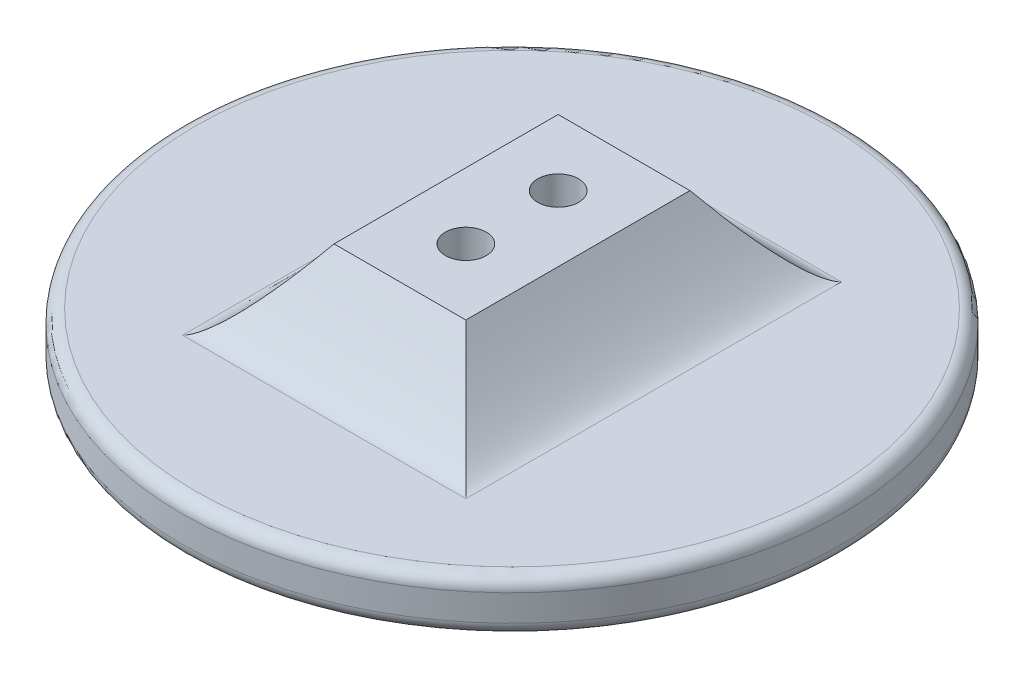
ISO-10303-21;
HEADER;
FILE_DESCRIPTION(('STEP AP214'),'2;1');
FILE_NAME('part.step','',(''),(''),'','','');
FILE_SCHEMA(('AUTOMOTIVE_DESIGN { 1 0 10303 214 1 1 1 1 }'));
ENDSEC;
DATA;
#1=APPLICATION_CONTEXT('core data for automotive mechanical design processes');
#2=APPLICATION_PROTOCOL_DEFINITION('international standard','automotive_design',2000,#1);
#3=PRODUCT_CONTEXT('',#1,'mechanical');
#4=PRODUCT('Part','Part','',(#3));
#5=PRODUCT_RELATED_PRODUCT_CATEGORY('part','',(#4));
#6=PRODUCT_DEFINITION_FORMATION('','',#4);
#7=PRODUCT_DEFINITION_CONTEXT('part definition',#1,'design');
#8=PRODUCT_DEFINITION('design','',#6,#7);
#9=PRODUCT_DEFINITION_SHAPE('','',#8);
#10=(LENGTH_UNIT() NAMED_UNIT(*) SI_UNIT(.MILLI.,.METRE.));
#11=(NAMED_UNIT(*) PLANE_ANGLE_UNIT() SI_UNIT($,.RADIAN.));
#12=(NAMED_UNIT(*) SI_UNIT($,.STERADIAN.) SOLID_ANGLE_UNIT());
#13=UNCERTAINTY_MEASURE_WITH_UNIT(LENGTH_MEASURE(1.E-05),#10,'distance_accuracy_value','');
#14=(GEOMETRIC_REPRESENTATION_CONTEXT(3) GLOBAL_UNCERTAINTY_ASSIGNED_CONTEXT((#13)) GLOBAL_UNIT_ASSIGNED_CONTEXT((#10,
#11,#12)) REPRESENTATION_CONTEXT('',''));
#15=CARTESIAN_POINT('',(0.,0.,0.));
#16=DIRECTION('',(0.,0.,1.));
#17=DIRECTION('',(1.,0.,0.));
#18=AXIS2_PLACEMENT_3D('',#15,#16,#17);
#19=CARTESIAN_POINT('',(0.,0.,0.));
#20=DIRECTION('',(0.,1.,0.));
#21=DIRECTION('',(0.,0.,1.));
#22=AXIS2_PLACEMENT_3D('',#19,#20,#21);
#23=PLANE('',#22);
#24=CARTESIAN_POINT('',(0.,0.,0.));
#25=DIRECTION('',(0.,1.,0.));
#26=DIRECTION('',(0.,0.,1.));
#27=AXIS2_PLACEMENT_3D('',#24,#25,#26);
#28=CIRCLE('',#27,24.);
#29=CARTESIAN_POINT('',(0.,0.,24.));
#30=VERTEX_POINT('',#29);
#31=EDGE_CURVE('E12',#30,#30,#28,.F.);
#32=ORIENTED_EDGE('',*,*,#31,.T.);
#33=EDGE_LOOP('',(#32));
#34=FACE_BOUND('',#33,.T.);
#35=CARTESIAN_POINT('',(0.,0.,3.5));
#36=DIRECTION('',(0.,-1.,0.));
#37=DIRECTION('',(0.,0.,-1.));
#38=AXIS2_PLACEMENT_3D('',#35,#36,#37);
#39=CIRCLE('',#38,2.9);
#40=CARTESIAN_POINT('',(0.,0.,0.6));
#41=VERTEX_POINT('',#40);
#42=EDGE_CURVE('E352',#41,#41,#39,.T.);
#43=ORIENTED_EDGE('',*,*,#42,.F.);
#44=EDGE_LOOP('',(#43));
#45=FACE_BOUND('',#44,.T.);
#46=CARTESIAN_POINT('',(0.,0.,-3.5));
#47=DIRECTION('',(0.,1.,0.));
#48=DIRECTION('',(0.,0.,1.));
#49=AXIS2_PLACEMENT_3D('',#46,#47,#48);
#50=CIRCLE('',#49,2.9);
#51=CARTESIAN_POINT('',(0.,0.,-0.6));
#52=VERTEX_POINT('',#51);
#53=EDGE_CURVE('E348',#52,#52,#50,.T.);
#54=ORIENTED_EDGE('',*,*,#53,.T.);
#55=EDGE_LOOP('',(#54));
#56=FACE_BOUND('',#55,.T.);
#57=ADVANCED_FACE('F45',(#34,#45,#56),#23,.F.);
#58=CARTESIAN_POINT('',(0.,0.,3.5));
#59=DIRECTION('',(0.,1.,0.));
#60=DIRECTION('',(0.,0.,1.));
#61=AXIS2_PLACEMENT_3D('',#58,#59,#60);
#62=CYLINDRICAL_SURFACE('',#61,1.55);
#63=CARTESIAN_POINT('',(0.,10.,3.5));
#64=DIRECTION('',(0.,-1.,0.));
#65=DIRECTION('',(0.,0.,-1.));
#66=AXIS2_PLACEMENT_3D('',#63,#64,#65);
#67=CIRCLE('',#66,1.55);
#68=CARTESIAN_POINT('',(0.,10.,1.95));
#69=VERTEX_POINT('',#68);
#70=EDGE_CURVE('E253',#69,#69,#67,.T.);
#71=ORIENTED_EDGE('',*,*,#70,.F.);
#72=EDGE_LOOP('',(#71));
#73=FACE_BOUND('',#72,.T.);
#74=CARTESIAN_POINT('',(0.,6.1,3.5));
#75=DIRECTION('',(0.,-1.,0.));
#76=DIRECTION('',(0.,0.,-1.));
#77=AXIS2_PLACEMENT_3D('',#74,#75,#76);
#78=CIRCLE('',#77,1.55);
#79=CARTESIAN_POINT('',(0.,6.1,1.95));
#80=VERTEX_POINT('',#79);
#81=EDGE_CURVE('E248',#80,#80,#78,.T.);
#82=ORIENTED_EDGE('',*,*,#81,.T.);
#83=EDGE_LOOP('',(#82));
#84=FACE_BOUND('',#83,.T.);
#85=ADVANCED_FACE('F216',(#73,#84),#62,.F.);
#86=CARTESIAN_POINT('',(0.,10.,0.));
#87=DIRECTION('',(0.,-1.,0.));
#88=DIRECTION('',(0.,0.,-1.));
#89=AXIS2_PLACEMENT_3D('',#86,#87,#88);
#90=PLANE('',#89);
#91=CARTESIAN_POINT('',(5.,10.,-15.6690189111918));
#92=CARTESIAN_POINT('',(5.,10.,-15.1942001563072));
#93=CARTESIAN_POINT('',(5.,10.,-14.7193814014226));
#94=CARTESIAN_POINT('',(5.,10.,-4.74818754884601));
#95=CARTESIAN_POINT('',(5.,10.,4.74818754885425));
#96=CARTESIAN_POINT('',(5.,10.,14.7193814014222));
#97=CARTESIAN_POINT('',(5.,10.,15.1942001563075));
#98=CARTESIAN_POINT('',(5.,10.,15.6690189111918));
#99=(BOUNDED_CURVE() B_SPLINE_CURVE(3,(#91,#92,#93,#94,#95,#96,#97,#98),.UNSPECIFIED.,.F.,
.F.) B_SPLINE_CURVE_WITH_KNOTS((4,2,2,4),(-0.00716901891119183,-0.00574456264653803,
0.022744562646538,0.0241690189111918),
.UNSPECIFIED.) CURVE() GEOMETRIC_REPRESENTATION_ITEM() RATIONAL_B_SPLINE_CURVE((1.,1.,1.,1.,1.,
1.,1.,1.)) REPRESENTATION_ITEM(''));
#100=CARTESIAN_POINT('',(5.,10.,8.5));
#101=VERTEX_POINT('',#100);
#102=CARTESIAN_POINT('',(5.,10.,-8.5));
#103=VERTEX_POINT('',#102);
#104=EDGE_CURVE('E90',#101,#103,#99,.F.);
#105=ORIENTED_EDGE('',*,*,#104,.T.);
#106=CARTESIAN_POINT('',(-11.8817907788649,10.,-8.5));
#107=CARTESIAN_POINT('',(-11.5027147347557,10.,-8.5));
#108=CARTESIAN_POINT('',(-11.1236386906473,10.,-8.5));
#109=CARTESIAN_POINT('',(-3.16304176435211,10.,-8.5));
#110=CARTESIAN_POINT('',(4.41847911782066,10.,-8.5));
#111=CARTESIAN_POINT('',(12.379076044109,10.,-8.5));
#112=CARTESIAN_POINT('',(12.7581520882179,10.,-8.5));
#113=CARTESIAN_POINT('',(13.1372281323269,10.,-8.5));
#114=(BOUNDED_CURVE() B_SPLINE_CURVE(3,(#106,#107,#108,#109,#110,#111,#112,#113),.UNSPECIFIED.,
.F.,.F.) B_SPLINE_CURVE_WITH_KNOTS((4,2,2,4),(-0.0181372281323269,-0.017,0.00574456264653803,
0.00688179077886493),
.UNSPECIFIED.) CURVE() GEOMETRIC_REPRESENTATION_ITEM() RATIONAL_B_SPLINE_CURVE((1.,1.,1.,1.,1.,
1.,1.,1.)) REPRESENTATION_ITEM(''));
#115=CARTESIAN_POINT('',(-5.,10.,-8.5));
#116=VERTEX_POINT('',#115);
#117=EDGE_CURVE('E97',#103,#116,#114,.F.);
#118=ORIENTED_EDGE('',*,*,#117,.T.);
#119=CARTESIAN_POINT('',(-5.,10.,17.05));
#120=CARTESIAN_POINT('',(-5.,10.,16.533333333333));
#121=CARTESIAN_POINT('',(-5.,10.,16.0166666666671));
#122=CARTESIAN_POINT('',(-5.,10.,5.1666666666577));
#123=CARTESIAN_POINT('',(-5.,10.,-5.16666666666667));
#124=CARTESIAN_POINT('',(-5.,10.,-16.0166666666667));
#125=CARTESIAN_POINT('',(-5.,10.,-16.5333333333333));
#126=CARTESIAN_POINT('',(-5.,10.,-17.05));
#127=(BOUNDED_CURVE() B_SPLINE_CURVE(3,(#119,#120,#121,#122,#123,#124,#125,#126),.UNSPECIFIED.,
.F.,.F.) B_SPLINE_CURVE_WITH_KNOTS((4,2,2,4),(-0.02555,-0.024,0.007,0.00855),
.UNSPECIFIED.) CURVE() GEOMETRIC_REPRESENTATION_ITEM() RATIONAL_B_SPLINE_CURVE((1.,1.,1.,1.,1.,
1.,1.,1.)) REPRESENTATION_ITEM(''));
#128=CARTESIAN_POINT('',(-5.,10.,8.5));
#129=VERTEX_POINT('',#128);
#130=EDGE_CURVE('E126',#116,#129,#127,.F.);
#131=ORIENTED_EDGE('',*,*,#130,.T.);
#132=CARTESIAN_POINT('',(13.1372281323269,10.,8.5));
#133=CARTESIAN_POINT('',(12.7581520882179,10.,8.5));
#134=CARTESIAN_POINT('',(12.379076044109,10.,8.5));
#135=CARTESIAN_POINT('',(4.41847911782066,10.,8.5));
#136=CARTESIAN_POINT('',(-3.16304176435211,10.,8.5));
#137=CARTESIAN_POINT('',(-11.1236386906473,10.,8.5));
#138=CARTESIAN_POINT('',(-11.5027147347557,10.,8.5));
#139=CARTESIAN_POINT('',(-11.8817907788649,10.,8.5));
#140=(BOUNDED_CURVE() B_SPLINE_CURVE(3,(#132,#133,#134,#135,#136,#137,#138,#139),.UNSPECIFIED.,
.F.,.F.) B_SPLINE_CURVE_WITH_KNOTS((4,2,2,4),(-0.00688179077886493,-0.00574456264653803,0.017,
0.0181372281323269),
.UNSPECIFIED.) CURVE() GEOMETRIC_REPRESENTATION_ITEM() RATIONAL_B_SPLINE_CURVE((1.,1.,1.,1.,1.,
1.,1.,1.)) REPRESENTATION_ITEM(''));
#141=EDGE_CURVE('E100',#129,#101,#140,.F.);
#142=ORIENTED_EDGE('',*,*,#141,.T.);
#143=EDGE_LOOP('',(#105,#118,#131,#142));
#144=FACE_BOUND('',#143,.T.);
#145=ORIENTED_EDGE('',*,*,#70,.T.);
#146=EDGE_LOOP('',(#145));
#147=FACE_BOUND('',#146,.T.);
#148=CARTESIAN_POINT('',(0.,10.,-3.5));
#149=DIRECTION('',(0.,1.,0.));
#150=DIRECTION('',(0.,0.,1.));
#151=AXIS2_PLACEMENT_3D('',#148,#149,#150);
#152=CIRCLE('',#151,1.55);
#153=CARTESIAN_POINT('',(0.,10.,-1.95));
#154=VERTEX_POINT('',#153);
#155=EDGE_CURVE('E339',#154,#154,#152,.T.);
#156=ORIENTED_EDGE('',*,*,#155,.F.);
#157=EDGE_LOOP('',(#156));
#158=FACE_BOUND('',#157,.T.);
#159=ADVANCED_FACE('F93',(#144,#147,#158),#90,.F.);
#160=CARTESIAN_POINT('',(0.,4.,0.));
#161=DIRECTION('',(0.,-1.,0.));
#162=DIRECTION('',(0.,0.,-1.));
#163=AXIS2_PLACEMENT_3D('',#160,#161,#162);
#164=CYLINDRICAL_SURFACE('',#163,25.);
#165=CARTESIAN_POINT('',(0.,3.,0.));
#166=DIRECTION('',(0.,1.,0.));
#167=DIRECTION('',(0.,0.,1.));
#168=AXIS2_PLACEMENT_3D('',#165,#166,#167);
#169=CIRCLE('',#168,25.);
#170=CARTESIAN_POINT('',(0.,3.,25.));
#171=VERTEX_POINT('',#170);
#172=EDGE_CURVE('E54',#171,#171,#169,.F.);
#173=ORIENTED_EDGE('',*,*,#172,.T.);
#174=EDGE_LOOP('',(#173));
#175=FACE_BOUND('',#174,.T.);
#176=CARTESIAN_POINT('',(0.,1.,0.));
#177=DIRECTION('',(0.,1.,0.));
#178=DIRECTION('',(0.,0.,1.));
#179=AXIS2_PLACEMENT_3D('',#176,#177,#178);
#180=CIRCLE('',#179,25.);
#181=CARTESIAN_POINT('',(0.,1.,25.));
#182=VERTEX_POINT('',#181);
#183=EDGE_CURVE('E258',#182,#182,#180,.T.);
#184=ORIENTED_EDGE('',*,*,#183,.T.);
#185=EDGE_LOOP('',(#184));
#186=FACE_BOUND('',#185,.T.);
#187=ADVANCED_FACE('F215',(#175,#186),#164,.T.);
#188=CARTESIAN_POINT('',(0.,4.,0.));
#189=DIRECTION('',(0.,1.,0.));
#190=DIRECTION('',(0.,0.,1.));
#191=AXIS2_PLACEMENT_3D('',#188,#189,#190);
#192=PLANE('',#191);
#193=CARTESIAN_POINT('',(0.,4.,0.));
#194=DIRECTION('',(0.,1.,0.));
#195=DIRECTION('',(0.,0.,1.));
#196=AXIS2_PLACEMENT_3D('',#193,#194,#195);
#197=CIRCLE('',#196,24.);
#198=CARTESIAN_POINT('',(0.,4.,24.));
#199=VERTEX_POINT('',#198);
#200=EDGE_CURVE('E254',#199,#199,#197,.T.);
#201=ORIENTED_EDGE('',*,*,#200,.T.);
#202=EDGE_LOOP('',(#201));
#203=FACE_BOUND('',#202,.T.);
#204=CARTESIAN_POINT('',(-11.8817907788649,4.,14.244562646538));
#205=CARTESIAN_POINT('',(-11.5027147347557,4.,14.244562646538));
#206=CARTESIAN_POINT('',(-11.1236386906473,4.,14.244562646538));
#207=CARTESIAN_POINT('',(-3.16304176435211,4.,14.244562646538));
#208=CARTESIAN_POINT('',(4.41847911782066,4.,14.244562646538));
#209=CARTESIAN_POINT('',(12.379076044109,4.,14.244562646538));
#210=CARTESIAN_POINT('',(12.7581520882179,4.,14.244562646538));
#211=CARTESIAN_POINT('',(13.1372281323269,4.,14.244562646538));
#212=(BOUNDED_CURVE() B_SPLINE_CURVE(3,(#204,#205,#206,#207,#208,#209,#210,#211),.UNSPECIFIED.,
.F.,.F.) B_SPLINE_CURVE_WITH_KNOTS((4,2,2,4),(-0.00688179077886493,-0.00574456264653803,0.017,
0.0181372281323269),
.UNSPECIFIED.) CURVE() GEOMETRIC_REPRESENTATION_ITEM() RATIONAL_B_SPLINE_CURVE((1.,1.,1.,1.,1.,
1.,1.,1.)) REPRESENTATION_ITEM(''));
#213=CARTESIAN_POINT('',(10.744562646538,4.,14.2445626465165));
#214=VERTEX_POINT('',#213);
#215=CARTESIAN_POINT('',(-10.7445626465551,4.,14.244562646538));
#216=VERTEX_POINT('',#215);
#217=EDGE_CURVE('E70',#214,#216,#212,.F.);
#218=ORIENTED_EDGE('',*,*,#217,.T.);
#219=CARTESIAN_POINT('',(-10.744562646538,4.,-17.05));
#220=CARTESIAN_POINT('',(-10.744562646538,4.,-16.5333333333333));
#221=CARTESIAN_POINT('',(-10.744562646538,4.,-16.0166666666667));
#222=CARTESIAN_POINT('',(-10.744562646538,4.,-5.16666666666667));
#223=CARTESIAN_POINT('',(-10.744562646538,4.,5.1666666666577));
#224=CARTESIAN_POINT('',(-10.744562646538,4.,16.0166666666671));
#225=CARTESIAN_POINT('',(-10.744562646538,4.,16.533333333333));
#226=CARTESIAN_POINT('',(-10.744562646538,4.,17.05));
#227=(BOUNDED_CURVE() B_SPLINE_CURVE(3,(#219,#220,#221,#222,#223,#224,#225,#226),.UNSPECIFIED.,
.F.,.F.) B_SPLINE_CURVE_WITH_KNOTS((4,2,2,4),(-0.02555,-0.024,0.007,0.00855),
.UNSPECIFIED.) CURVE() GEOMETRIC_REPRESENTATION_ITEM() RATIONAL_B_SPLINE_CURVE((1.,1.,1.,1.,1.,
1.,1.,1.)) REPRESENTATION_ITEM(''));
#228=CARTESIAN_POINT('',(-10.744562646555,4.,-14.244562646538));
#229=VERTEX_POINT('',#228);
#230=EDGE_CURVE('E259',#216,#229,#227,.F.);
#231=ORIENTED_EDGE('',*,*,#230,.T.);
#232=CARTESIAN_POINT('',(13.1372281323269,4.,-14.244562646538));
#233=CARTESIAN_POINT('',(12.7581520882179,4.,-14.244562646538));
#234=CARTESIAN_POINT('',(12.379076044109,4.,-14.244562646538));
#235=CARTESIAN_POINT('',(4.41847911782066,4.,-14.244562646538));
#236=CARTESIAN_POINT('',(-3.16304176435211,4.,-14.244562646538));
#237=CARTESIAN_POINT('',(-11.1236386906473,4.,-14.244562646538));
#238=CARTESIAN_POINT('',(-11.5027147347557,4.,-14.244562646538));
#239=CARTESIAN_POINT('',(-11.8817907788649,4.,-14.244562646538));
#240=(BOUNDED_CURVE() B_SPLINE_CURVE(3,(#232,#233,#234,#235,#236,#237,#238,#239),.UNSPECIFIED.,
.F.,.F.) B_SPLINE_CURVE_WITH_KNOTS((4,2,2,4),(-0.0181372281323269,-0.017,0.00574456264653803,
0.00688179077886493),
.UNSPECIFIED.) CURVE() GEOMETRIC_REPRESENTATION_ITEM() RATIONAL_B_SPLINE_CURVE((1.,1.,1.,1.,1.,
1.,1.,1.)) REPRESENTATION_ITEM(''));
#241=CARTESIAN_POINT('',(10.744562646538,4.,-14.2445626465373));
#242=VERTEX_POINT('',#241);
#243=EDGE_CURVE('E381',#229,#242,#240,.F.);
#244=ORIENTED_EDGE('',*,*,#243,.T.);
#245=CARTESIAN_POINT('',(10.744562646538,4.,15.6690189111918));
#246=CARTESIAN_POINT('',(10.744562646538,4.,15.1942001563075));
#247=CARTESIAN_POINT('',(10.744562646538,4.,14.7193814014222));
#248=CARTESIAN_POINT('',(10.744562646538,4.,4.74818754885425));
#249=CARTESIAN_POINT('',(10.744562646538,4.,-4.74818754884601));
#250=CARTESIAN_POINT('',(10.744562646538,4.,-14.7193814014226));
#251=CARTESIAN_POINT('',(10.744562646538,4.,-15.1942001563072));
#252=CARTESIAN_POINT('',(10.744562646538,4.,-15.6690189111918));
#253=(BOUNDED_CURVE() B_SPLINE_CURVE(3,(#245,#246,#247,#248,#249,#250,#251,#252),.UNSPECIFIED.,
.F.,.F.) B_SPLINE_CURVE_WITH_KNOTS((4,2,2,4),(-0.00716901891119183,-0.00574456264653803,
0.022744562646538,0.0241690189111918),
.UNSPECIFIED.) CURVE() GEOMETRIC_REPRESENTATION_ITEM() RATIONAL_B_SPLINE_CURVE((1.,1.,1.,1.,1.,
1.,1.,1.)) REPRESENTATION_ITEM(''));
#254=EDGE_CURVE('E114',#242,#214,#253,.F.);
#255=ORIENTED_EDGE('',*,*,#254,.T.);
#256=EDGE_LOOP('',(#218,#231,#244,#255));
#257=FACE_BOUND('',#256,.T.);
#258=ADVANCED_FACE('F218',(#203,#257),#192,.T.);
#259=CARTESIAN_POINT('',(5.,10.,15.6690189111918));
#260=CARTESIAN_POINT('',(5.,10.,15.1942001563075));
#261=CARTESIAN_POINT('',(5.,10.,14.7193814014222));
#262=CARTESIAN_POINT('',(5.,10.,4.74818754885425));
#263=CARTESIAN_POINT('',(5.,10.,-4.74818754884601));
#264=CARTESIAN_POINT('',(5.,10.,-14.7193814014226));
#265=CARTESIAN_POINT('',(5.,10.,-15.1942001563072));
#266=CARTESIAN_POINT('',(5.,10.,-15.6690189111918));
#267=CARTESIAN_POINT('',(9.17786374293675,4.,15.6690189111918));
#268=CARTESIAN_POINT('',(9.17786374293675,4.,15.1942001563075));
#269=CARTESIAN_POINT('',(9.17786374293675,4.,14.7193814014222));
#270=CARTESIAN_POINT('',(9.17786374293675,4.,4.74818754885425));
#271=CARTESIAN_POINT('',(9.17786374293675,4.,-4.74818754884601));
#272=CARTESIAN_POINT('',(9.17786374293675,4.,-14.7193814014226));
#273=CARTESIAN_POINT('',(9.17786374293675,4.,-15.1942001563072));
#274=CARTESIAN_POINT('',(9.17786374293675,4.,-15.6690189111918));
#275=CARTESIAN_POINT('',(10.744562646538,4.,15.6690189111918));
#276=CARTESIAN_POINT('',(10.744562646538,4.,15.1942001563075));
#277=CARTESIAN_POINT('',(10.744562646538,4.,14.7193814014222));
#278=CARTESIAN_POINT('',(10.744562646538,4.,4.74818754885425));
#279=CARTESIAN_POINT('',(10.744562646538,4.,-4.74818754884601));
#280=CARTESIAN_POINT('',(10.744562646538,4.,-14.7193814014226));
#281=CARTESIAN_POINT('',(10.744562646538,4.,-15.1942001563072));
#282=CARTESIAN_POINT('',(10.744562646538,4.,-15.6690189111918));
#283=(BOUNDED_SURFACE() B_SPLINE_SURFACE(2,3,((#259,#260,#261,#262,#263,#264,#265,#266),(#267,
#268,#269,#270,#271,#272,#273,#274),(#275,#276,#277,#278,#279,#280,#281,#282)),.UNSPECIFIED.,
.F.,.F.,.F.) B_SPLINE_SURFACE_WITH_KNOTS((3,3),(4,2,2,4),(0.,1.),(-0.00716901891119183,
-0.00574456264653803,0.022744562646538,0.0241690189111918),
.UNSPECIFIED.) GEOMETRIC_REPRESENTATION_ITEM() RATIONAL_B_SPLINE_SURFACE(((1.,1.,1.,1.,1.,1.,1.,
1.),(0.886405260427918,0.886405260427918,0.886405260427918,0.886405260427918,0.886405260427918,
0.886405260427918,0.886405260427918,0.886405260427918),(1.,1.,1.,1.,1.,1.,1.,1.))) REPRESENTATION_ITEM('') SURFACE());
#284=CARTESIAN_POINT('',(10.7445626465393,4.,14.244562646538));
#285=CARTESIAN_POINT('',(10.7332712110502,4.00000088450244,14.2332713393006));
#286=CARTESIAN_POINT('',(10.7219774747557,4.00029748881483,14.221984906246));
#287=CARTESIAN_POINT('',(10.6990102338456,4.00145539801306,14.1990438716068));
#288=CARTESIAN_POINT('',(10.6873370072327,4.00233574669762,14.1873899377852));
#289=CARTESIAN_POINT('',(10.6636109924538,4.00466797712799,14.1637117223783));
#290=CARTESIAN_POINT('',(10.6515589901475,4.00613851293399,14.1516885213183));
#291=CARTESIAN_POINT('',(10.6270750579775,4.00965946342711,14.1272693653449));
#292=CARTESIAN_POINT('',(10.6146443531626,4.01172812054216,14.1148748485504));
#293=CARTESIAN_POINT('',(10.5761304208036,4.01893586316296,14.0764790773808));
#294=CARTESIAN_POINT('',(10.5501241963843,4.02494353613716,14.0505612697444));
#295=CARTESIAN_POINT('',(10.4965826684866,4.03929978084282,13.9972023577703));
#296=CARTESIAN_POINT('',(10.4690656458864,4.04778125128026,13.9697795124293));
#297=CARTESIAN_POINT('',(10.4124953525799,4.06714911682546,13.9133917875377));
#298=CARTESIAN_POINT('',(10.3834638942228,4.07815927843524,13.8844478995361));
#299=CARTESIAN_POINT('',(10.3238622175821,4.10264450268669,13.8250060932629));
#300=CARTESIAN_POINT('',(10.2933164473649,4.11623408698512,13.7945312390893));
#301=CARTESIAN_POINT('',(10.2306836758385,4.14593511313779,13.7320179092761));
#302=CARTESIAN_POINT('',(10.1986227477131,4.16215215696602,13.7000037887345));
#303=CARTESIAN_POINT('',(10.1329584448309,4.19716114943245,13.6344060494039));
#304=CARTESIAN_POINT('',(10.0993820397259,4.21605025364861,13.600847551819));
#305=CARTESIAN_POINT('',(10.0306857973293,4.25645162107094,13.532158043888));
#306=CARTESIAN_POINT('',(9.99559319990861,4.27805312133091,13.4970524771124));
#307=CARTESIAN_POINT('',(9.92386569111691,4.32392496889996,13.425270581303));
#308=CARTESIAN_POINT('',(9.88725791398104,4.34827733940862,13.3886197958539));
#309=CARTESIAN_POINT('',(9.77207465379112,4.42747609656871,13.2732660511863));
#310=CARTESIAN_POINT('',(9.69435477967081,4.48475820035106,13.1953786907622));
#311=CARTESIAN_POINT('',(9.53266001933544,4.61010963929512,13.0333122151969));
#312=CARTESIAN_POINT('',(9.44888273532293,4.67868040202563,12.9493286912178));
#313=CARTESIAN_POINT('',(9.27507584058506,4.82682158090316,12.7751979509615));
#314=CARTESIAN_POINT('',(9.18522210979277,4.90681512363852,12.6852370764013));
#315=CARTESIAN_POINT('',(8.98942355069897,5.08703667796777,12.489405593496));
#316=CARTESIAN_POINT('',(8.88385103794368,5.18811398242896,12.3839478183384));
#317=CARTESIAN_POINT('',(8.66243022101174,5.40699799659959,12.162703182607));
#318=CARTESIAN_POINT('',(8.54686182595921,5.52536032976491,12.047188222617));
#319=CARTESIAN_POINT('',(8.30543550228516,5.77974255970212,11.8057661703184));
#320=CARTESIAN_POINT('',(8.17985123429531,5.91626864264826,11.6801207525125));
#321=CARTESIAN_POINT('',(7.91841883832071,6.207696245625,11.4185198041119));
#322=CARTESIAN_POINT('',(7.78282740238865,6.36305347528141,11.2828168905402));
#323=CARTESIAN_POINT('',(7.54847627185458,6.63743245998007,11.0484840831039));
#324=CARTESIAN_POINT('',(7.44920354233401,6.75553515723918,10.9492865253215));
#325=CARTESIAN_POINT('',(7.24146038503631,7.00639663827702,10.7416686299003));
#326=CARTESIAN_POINT('',(7.13312916820698,7.13938307026702,10.6333840043002));
#327=CARTESIAN_POINT('',(6.90725385810642,7.42079840041075,10.4075240756041));
#328=CARTESIAN_POINT('',(6.7898562145024,7.56945557419437,10.2900870862512));
#329=CARTESIAN_POINT('',(6.54589690331705,7.88286712629403,10.0459634929886));
#330=CARTESIAN_POINT('',(6.41948347671009,8.047846313483,9.91941760340062));
#331=CARTESIAN_POINT('',(6.21511561926378,8.31783428074332,9.7151568017267));
#332=CARTESIAN_POINT('',(6.13675776353485,8.4221430317776,9.63691764740559));
#333=CARTESIAN_POINT('',(5.96022242096983,8.65909987875716,9.46061565147281));
#334=CARTESIAN_POINT('',(5.86222887132644,8.79201533516812,9.3627275427966));
#335=CARTESIAN_POINT('',(5.64639781277575,9.08781674448696,9.14694057117726));
#336=CARTESIAN_POINT('',(5.52880317311967,9.25102723861919,9.0292440376685));
#337=CARTESIAN_POINT('',(5.27374210553923,9.60890371474885,8.77392174206315));
#338=CARTESIAN_POINT('',(5.13652629394842,9.80392241731875,8.63653954238311));
#339=CARTESIAN_POINT('',(5.,10.,8.5));
#340=B_SPLINE_CURVE_WITH_KNOTS('',3,(#284,#285,#286,#287,#288,#289,#290,#291,#292,#293,#294,
#295,#296,#297,#298,#299,#300,#301,#302,#303,#304,#305,#306,#307,#308,#309,#310,#311,#312,#313,
#314,#315,#316,#317,#318,#319,#320,#321,#322,#323,#324,#325,#326,#327,#328,#329,#330,#331,#332,
#333,#334,#335,#336,#337,#338,#339),.UNSPECIFIED.,.F.,.F.,(4,2,2,2,2,2,2,2,2,2,2,2,2,2,2,2,2,2,
2,2,2,2,2,2,2,2,2,4),(0.,0.047899863518104,0.0974447621165193,0.14869740829785,0.2017168687383,
0.313264610052269,0.432507612598309,0.559806882809771,0.695482595985445,0.839818391132723,
0.993064855607003,1.1554422950419,1.32714290065252,1.69912404466502,2.11007127235157,
2.56063652237194,3.10123271975559,3.70643971569489,4.37850363166233,5.11898774179116,
5.66923407115474,6.27774787637094,6.94634355684612,7.67632496749501,8.13269238897463,
8.70858259078499,9.407759250447,10.2333293545683),.UNSPECIFIED.);
#341=EDGE_CURVE('E119',#214,#101,#340,.T.);
#342=CARTESIAN_POINT('',(5.,10.,-8.5));
#343=CARTESIAN_POINT('',(5.13652629394841,9.80392241731876,-8.6365395423831));
#344=CARTESIAN_POINT('',(5.27374210553921,9.60890371474889,-8.77392174206312));
#345=CARTESIAN_POINT('',(5.52880317311961,9.25102723861927,-9.02924403766844));
#346=CARTESIAN_POINT('',(5.64639781277567,9.08781674448706,-9.14694057117719));
#347=CARTESIAN_POINT('',(5.86222887132632,8.79201533516828,-9.36272754279648));
#348=CARTESIAN_POINT('',(5.96022242096969,8.65909987875735,-9.46061565147268));
#349=CARTESIAN_POINT('',(6.13675776353466,8.42214303177785,-9.6369176474054));
#350=CARTESIAN_POINT('',(6.21511561926357,8.31783428074361,-9.71515680172649));
#351=CARTESIAN_POINT('',(6.41948347670981,8.04784631348336,-9.91941760340035));
#352=CARTESIAN_POINT('',(6.54589690331674,7.88286712629442,-10.0459634929883));
#353=CARTESIAN_POINT('',(6.78985621450203,7.56945557419482,-10.2900870862509));
#354=CARTESIAN_POINT('',(6.90725385810603,7.42079840041124,-10.4075240756037));
#355=CARTESIAN_POINT('',(7.13312916820656,7.13938307026755,-10.6333840042998));
#356=CARTESIAN_POINT('',(7.24146038503586,7.00639663827757,-10.7416686298999));
#357=CARTESIAN_POINT('',(7.44920354233353,6.75553515723976,-10.949286525321));
#358=CARTESIAN_POINT('',(7.54847627185408,6.63743245998065,-11.0484840831034));
#359=CARTESIAN_POINT('',(7.78282740238811,6.36305347528203,-11.2828168905397));
#360=CARTESIAN_POINT('',(7.91841883832017,6.20769624562566,-11.4185198041113));
#361=CARTESIAN_POINT('',(8.17985123429466,5.91626864264893,-11.6801207525119));
#362=CARTESIAN_POINT('',(8.30543550228441,5.77974255970278,-11.8057661703178));
#363=CARTESIAN_POINT('',(8.54686182595858,5.52536032976569,-12.0471882226162));
#364=CARTESIAN_POINT('',(8.66243022101131,5.40699799660049,-12.1627031826061));
#365=CARTESIAN_POINT('',(8.88385103794263,5.18811398242959,-12.3839478183377));
#366=CARTESIAN_POINT('',(8.98942355069721,5.08703667796808,-12.4894055934957));
#367=CARTESIAN_POINT('',(9.18522210985232,4.90681512358482,-12.6852370764596));
#368=CARTESIAN_POINT('',(9.27507584070725,4.82682158079812,-12.7751979510796));
#369=CARTESIAN_POINT('',(9.44888273555419,4.67868040184746,-12.9493286914321));
#370=CARTESIAN_POINT('',(9.53266001961207,4.61010963909339,-13.0333122154471));
#371=CARTESIAN_POINT('',(9.69435478002086,4.48475820012483,-13.1953786910643));
#372=CARTESIAN_POINT('',(9.77207465416843,4.42747609633984,-13.2732660515039));
#373=CARTESIAN_POINT('',(9.88725791439306,4.3482773391839,-13.3886197961885));
#374=CARTESIAN_POINT('',(9.92386569153572,4.32392496867979,-13.4252705816386));
#375=CARTESIAN_POINT('',(9.99559320033652,4.2780531211228,-13.4970524774465));
#376=CARTESIAN_POINT('',(10.0306857977595,4.25645162087015,-13.5321580442193));
#377=CARTESIAN_POINT('',(10.0993820401562,4.21605025346461,-13.6008475521413));
#378=CARTESIAN_POINT('',(10.1329584452589,4.19716114925774,-13.6344060497199));
#379=CARTESIAN_POINT('',(10.1986227481321,4.16215215681123,-13.7000037890351));
#380=CARTESIAN_POINT('',(10.2306836762508,4.14593511299345,-13.7320179095675));
#381=CARTESIAN_POINT('',(10.2933164477591,4.11623408686223,-13.7945312393597));
#382=CARTESIAN_POINT('',(10.323862217965,4.10264450257464,-13.8250060935214));
#383=CARTESIAN_POINT('',(10.3834638945787,4.07815927834463,-13.8844478997688));
#384=CARTESIAN_POINT('',(10.4124953529199,4.06714911674531,-13.9133917877563));
#385=CARTESIAN_POINT('',(10.4690656461903,4.04778125122004,-13.9697795126184));
#386=CARTESIAN_POINT('',(10.4965826687702,4.03929978079195,-13.9972023579436));
#387=CARTESIAN_POINT('',(10.5501241966227,4.02494353610327,-14.0505612698852));
#388=CARTESIAN_POINT('',(10.5761304210171,4.01893586313657,-14.0764790775045));
#389=CARTESIAN_POINT('',(10.6146443533361,4.01172812052514,-14.114874848649));
#390=CARTESIAN_POINT('',(10.6270750581369,4.00965946341293,-14.1272693654347));
#391=CARTESIAN_POINT('',(10.6515589902775,4.00613851292479,-14.1516885213904));
#392=CARTESIAN_POINT('',(10.6636109925685,4.00466797712091,-14.1637117224414));
#393=CARTESIAN_POINT('',(10.6873370073158,4.00233574669401,-14.1873899378303));
#394=CARTESIAN_POINT('',(10.6990102339123,4.00145539801078,-14.1990438716428));
#395=CARTESIAN_POINT('',(10.7219774747884,4.00029748881437,-14.2219849062638));
#396=CARTESIAN_POINT('',(10.7332712110654,4.00000088450245,-14.2332713393094));
#397=CARTESIAN_POINT('',(10.7445626465366,4.,-14.244562646538));
#398=B_SPLINE_CURVE_WITH_KNOTS('',3,(#342,#343,#344,#345,#346,#347,#348,#349,#350,#351,#352,
#353,#354,#355,#356,#357,#358,#359,#360,#361,#362,#363,#364,#365,#366,#367,#368,#369,#370,#371,
#372,#373,#374,#375,#376,#377,#378,#379,#380,#381,#382,#383,#384,#385,#386,#387,#388,#389,#390,
#391,#392,#393,#394,#395,#396,#397),.UNSPECIFIED.,.F.,.F.,(4,2,2,2,2,2,2,2,2,2,2,2,2,2,2,2,2,2,
2,2,2,2,2,2,2,2,2,4),(0.,0.825570104121231,1.52474676378314,2.10063696559337,2.55700438707283,
3.28698579772154,3.95558147819659,4.5640952834127,5.11434161277622,5.8548257229049,
6.52688963887221,7.1320966348114,7.67269283219498,8.12325808251695,8.53420531038788,
8.90618645448421,9.07788706010416,9.2402644995293,9.39351096397656,9.53784675908128,
9.67352247220043,9.80082174234276,9.92006474480822,10.031612486031,10.0846319464222,
10.1358845925518,10.185429491096,10.2333293545576),.UNSPECIFIED.);
#399=EDGE_CURVE('E107',#103,#242,#398,.T.);
#400=ORIENTED_EDGE('',*,*,#341,.F.);
#401=ORIENTED_EDGE('',*,*,#254,.F.);
#402=ORIENTED_EDGE('',*,*,#399,.F.);
#403=ORIENTED_EDGE('',*,*,#104,.F.);
#404=EDGE_LOOP('',(#400,#401,#402,#403));
#405=FACE_BOUND('',#404,.T.);
#406=ADVANCED_FACE('F113',(#405),#283,.T.);
#407=CARTESIAN_POINT('',(13.1372281323269,10.,-8.5));
#408=CARTESIAN_POINT('',(12.7581520882179,10.,-8.5));
#409=CARTESIAN_POINT('',(12.379076044109,10.,-8.5));
#410=CARTESIAN_POINT('',(4.41847911782066,10.,-8.5));
#411=CARTESIAN_POINT('',(-3.16304176435211,10.,-8.5));
#412=CARTESIAN_POINT('',(-11.1236386906473,10.,-8.5));
#413=CARTESIAN_POINT('',(-11.5027147347557,10.,-8.5));
#414=CARTESIAN_POINT('',(-11.8817907788649,10.,-8.5));
#415=CARTESIAN_POINT('',(13.1372281323269,4.,-12.6778637429368));
#416=CARTESIAN_POINT('',(12.7581520882179,4.,-12.6778637429368));
#417=CARTESIAN_POINT('',(12.379076044109,4.,-12.6778637429368));
#418=CARTESIAN_POINT('',(4.41847911782066,4.,-12.6778637429368));
#419=CARTESIAN_POINT('',(-3.16304176435211,4.,-12.6778637429368));
#420=CARTESIAN_POINT('',(-11.1236386906473,4.,-12.6778637429368));
#421=CARTESIAN_POINT('',(-11.5027147347557,4.,-12.6778637429368));
#422=CARTESIAN_POINT('',(-11.8817907788649,4.,-12.6778637429368));
#423=CARTESIAN_POINT('',(13.1372281323269,4.,-14.244562646538));
#424=CARTESIAN_POINT('',(12.7581520882179,4.,-14.244562646538));
#425=CARTESIAN_POINT('',(12.379076044109,4.,-14.244562646538));
#426=CARTESIAN_POINT('',(4.41847911782066,4.,-14.244562646538));
#427=CARTESIAN_POINT('',(-3.16304176435211,4.,-14.244562646538));
#428=CARTESIAN_POINT('',(-11.1236386906473,4.,-14.244562646538));
#429=CARTESIAN_POINT('',(-11.5027147347557,4.,-14.244562646538));
#430=CARTESIAN_POINT('',(-11.8817907788649,4.,-14.244562646538));
#431=(BOUNDED_SURFACE() B_SPLINE_SURFACE(2,3,((#407,#408,#409,#410,#411,#412,#413,#414),(#415,
#416,#417,#418,#419,#420,#421,#422),(#423,#424,#425,#426,#427,#428,#429,#430)),.UNSPECIFIED.,
.F.,.F.,.F.) B_SPLINE_SURFACE_WITH_KNOTS((3,3),(4,2,2,4),(0.,1.),(-0.0181372281323269,-0.017,
0.00574456264653803,0.00688179077886493),
.UNSPECIFIED.) GEOMETRIC_REPRESENTATION_ITEM() RATIONAL_B_SPLINE_SURFACE(((1.,1.,1.,1.,1.,1.,1.,
1.),(0.886405260427918,0.886405260427918,0.886405260427918,0.886405260427918,0.886405260427918,
0.886405260427918,0.886405260427918,0.886405260427918),(1.,1.,1.,1.,1.,1.,1.,1.))) REPRESENTATION_ITEM('') SURFACE());
#432=CARTESIAN_POINT('',(-5.,10.,-8.5));
#433=CARTESIAN_POINT('',(-5.13653954238306,9.80392241731881,-8.63652629394837));
#434=CARTESIAN_POINT('',(-5.27392174206305,9.60890371474898,-8.77374210553914));
#435=CARTESIAN_POINT('',(-5.52924403766833,9.25102723861942,-9.0288031731195));
#436=CARTESIAN_POINT('',(-5.64694057117707,9.08781674448723,-9.14639781277555));
#437=CARTESIAN_POINT('',(-5.86272754279637,8.79201533516844,-9.36222887132621));
#438=CARTESIAN_POINT('',(-5.96061565147258,8.65909987875749,-9.4602224209696));
#439=CARTESIAN_POINT('',(-6.13691764740536,8.42214303177791,-9.63675776353462));
#440=CARTESIAN_POINT('',(-6.21515680172649,8.31783428074361,-9.71511561926357));
#441=CARTESIAN_POINT('',(-6.41941760340039,8.04784631348331,-9.91948347670984));
#442=CARTESIAN_POINT('',(-6.54596349298832,7.88286712629438,-10.0458969033168));
#443=CARTESIAN_POINT('',(-6.79008708625089,7.56945557419479,-10.2898562145021));
#444=CARTESIAN_POINT('',(-6.90752407560376,7.4207984004112,-10.4072538581061));
#445=CARTESIAN_POINT('',(-7.13338400429981,7.13938307026751,-10.6331291682066));
#446=CARTESIAN_POINT('',(-7.24166862989992,7.00639663827752,-10.7414603850359));
#447=CARTESIAN_POINT('',(-7.4492865253211,6.75553515723968,-10.9492035423336));
#448=CARTESIAN_POINT('',(-7.5484840831035,6.63743245998056,-11.0484762718542));
#449=CARTESIAN_POINT('',(-7.78281689053975,6.36305347528192,-11.2828274023882));
#450=CARTESIAN_POINT('',(-7.91851980411145,6.20769624562554,-11.4184188383202));
#451=CARTESIAN_POINT('',(-8.180120752512,5.91626864264882,-11.6798512342948));
#452=CARTESIAN_POINT('',(-8.30576617031793,5.77974255970267,-11.8054355022845));
#453=CARTESIAN_POINT('',(-8.54718822261638,5.52536032976555,-12.0468618259587));
#454=CARTESIAN_POINT('',(-8.66270318260625,5.40699799660032,-12.1624302210113));
#455=CARTESIAN_POINT('',(-8.88394781833783,5.18811398242949,-12.3838510379428));
#456=CARTESIAN_POINT('',(-8.9894055934957,5.08703667796807,-12.4894235506976));
#457=CARTESIAN_POINT('',(-9.18523707644291,4.90681512360018,-12.6852221098353));
#458=CARTESIAN_POINT('',(-9.27519795104588,4.82682158082809,-12.7750758406724));
#459=CARTESIAN_POINT('',(-9.449328691371,4.67868040189824,-12.9488827354883));
#460=CARTESIAN_POINT('',(-9.53331221537582,4.61010963915087,-13.0326600195332));
#461=CARTESIAN_POINT('',(-9.69537869097826,4.48475820018927,-13.1943547799211));
#462=CARTESIAN_POINT('',(-9.77326605141346,4.42747609640502,-13.2720746540609));
#463=CARTESIAN_POINT('',(-9.8886197960932,4.34827733924789,-13.3872579142757));
#464=CARTESIAN_POINT('',(-9.92527058154305,4.32392496874249,-13.4238656914164));
#465=CARTESIAN_POINT('',(-9.99705247735133,4.27805312118206,-13.4955932002146));
#466=CARTESIAN_POINT('',(-10.032158044125,4.25645162092733,-13.5306857976369));
#467=CARTESIAN_POINT('',(-10.1008475520495,4.216050253517,-13.5993820400336));
#468=CARTESIAN_POINT('',(-10.1344060496299,4.19716114930749,-13.632958445137));
#469=CARTESIAN_POINT('',(-10.2000037889495,4.1621521568553,-13.6986227480127));
#470=CARTESIAN_POINT('',(-10.2320179094845,4.14593511303455,-13.7306836761333));
#471=CARTESIAN_POINT('',(-10.2945312392827,4.11623408689722,-13.7933164476467));
#472=CARTESIAN_POINT('',(-10.3250060934478,4.10264450260654,-13.8238622178558));
#473=CARTESIAN_POINT('',(-10.3844478997026,4.07815927837043,-13.8834638944772));
#474=CARTESIAN_POINT('',(-10.4133917876941,4.06714911676813,-13.9124953528229));
#475=CARTESIAN_POINT('',(-10.4697795125646,4.04778125123719,-13.9690656461036));
#476=CARTESIAN_POINT('',(-10.4972023578943,4.03929978080643,-13.9965826686893));
#477=CARTESIAN_POINT('',(-10.5505612698451,4.02494353611292,-14.0501241965546));
#478=CARTESIAN_POINT('',(-10.5764790774692,4.01893586314409,-14.0761304209561));
#479=CARTESIAN_POINT('',(-10.6148748486209,4.01172812052999,-14.1146443532865));
#480=CARTESIAN_POINT('',(-10.6272693654092,4.00965946341697,-14.1270750580913));
#481=CARTESIAN_POINT('',(-10.6516885213699,4.00613851292741,-14.1515589902402));
#482=CARTESIAN_POINT('',(-10.6637117224235,4.00466797712293,-14.1636109925356));
#483=CARTESIAN_POINT('',(-10.6873899378175,4.00233574669504,-14.1873370072918));
#484=CARTESIAN_POINT('',(-10.6990438716326,4.00145539801143,-14.199010233893));
#485=CARTESIAN_POINT('',(-10.7219849062587,4.0002974888145,-14.2219774747788));
#486=CARTESIAN_POINT('',(-10.7332713393069,4.00000088450244,-14.2332712110608));
#487=CARTESIAN_POINT('',(-10.744562646538,4.,-14.244562646537));
#488=B_SPLINE_CURVE_WITH_KNOTS('',3,(#432,#433,#434,#435,#436,#437,#438,#439,#440,#441,#442,
#443,#444,#445,#446,#447,#448,#449,#450,#451,#452,#453,#454,#455,#456,#457,#458,#459,#460,#461,
#462,#463,#464,#465,#466,#467,#468,#469,#470,#471,#472,#473,#474,#475,#476,#477,#478,#479,#480,
#481,#482,#483,#484,#485,#486,#487),.UNSPECIFIED.,.F.,.F.,(4,2,2,2,2,2,2,2,2,2,2,2,2,2,2,2,2,2,
2,2,2,2,2,2,2,2,2,4),(0.,0.82557010412103,1.52474676378288,2.10063696559322,2.55700438707291,
3.2869857977216,3.95558147819665,4.56409528341279,5.11434161277638,5.85482572290508,
6.52688963887242,7.13209663481162,7.67269283219522,8.12325808243137,8.53420531024984,
8.90618645432231,9.07788705993961,9.24026449936752,9.39351096382247,9.5378467589393,
9.67352247207452,9.80082174223652,9.9200647447249,10.0316124859737,10.0846319463788,
10.1358845925231,10.1854294910828,10.2333293545604),.UNSPECIFIED.);
#489=EDGE_CURVE('E61',#116,#229,#488,.T.);
#490=ORIENTED_EDGE('',*,*,#399,.T.);
#491=ORIENTED_EDGE('',*,*,#243,.F.);
#492=ORIENTED_EDGE('',*,*,#489,.F.);
#493=ORIENTED_EDGE('',*,*,#117,.F.);
#494=EDGE_LOOP('',(#490,#491,#492,#493));
#495=FACE_BOUND('',#494,.T.);
#496=ADVANCED_FACE('F123',(#495),#431,.T.);
#497=CARTESIAN_POINT('',(-11.8817907788649,10.,8.5));
#498=CARTESIAN_POINT('',(-11.5027147347557,10.,8.5));
#499=CARTESIAN_POINT('',(-11.1236386906473,10.,8.5));
#500=CARTESIAN_POINT('',(-3.16304176435211,10.,8.5));
#501=CARTESIAN_POINT('',(4.41847911782066,10.,8.5));
#502=CARTESIAN_POINT('',(12.379076044109,10.,8.5));
#503=CARTESIAN_POINT('',(12.7581520882179,10.,8.5));
#504=CARTESIAN_POINT('',(13.1372281323269,10.,8.5));
#505=CARTESIAN_POINT('',(-11.8817907788649,4.,12.6778637429368));
#506=CARTESIAN_POINT('',(-11.5027147347557,4.,12.6778637429368));
#507=CARTESIAN_POINT('',(-11.1236386906473,4.,12.6778637429368));
#508=CARTESIAN_POINT('',(-3.16304176435211,4.,12.6778637429368));
#509=CARTESIAN_POINT('',(4.41847911782066,4.,12.6778637429368));
#510=CARTESIAN_POINT('',(12.379076044109,4.,12.6778637429368));
#511=CARTESIAN_POINT('',(12.7581520882179,4.,12.6778637429368));
#512=CARTESIAN_POINT('',(13.1372281323269,4.,12.6778637429368));
#513=CARTESIAN_POINT('',(-11.8817907788649,4.,14.244562646538));
#514=CARTESIAN_POINT('',(-11.5027147347557,4.,14.244562646538));
#515=CARTESIAN_POINT('',(-11.1236386906473,4.,14.244562646538));
#516=CARTESIAN_POINT('',(-3.16304176435211,4.,14.244562646538));
#517=CARTESIAN_POINT('',(4.41847911782066,4.,14.244562646538));
#518=CARTESIAN_POINT('',(12.379076044109,4.,14.244562646538));
#519=CARTESIAN_POINT('',(12.7581520882179,4.,14.244562646538));
#520=CARTESIAN_POINT('',(13.1372281323269,4.,14.244562646538));
#521=(BOUNDED_SURFACE() B_SPLINE_SURFACE(2,3,((#497,#498,#499,#500,#501,#502,#503,#504),(#505,
#506,#507,#508,#509,#510,#511,#512),(#513,#514,#515,#516,#517,#518,#519,#520)),.UNSPECIFIED.,
.F.,.F.,.F.) B_SPLINE_SURFACE_WITH_KNOTS((3,3),(4,2,2,4),(0.,1.),(-0.00688179077886493,
-0.00574456264653803,0.017,0.0181372281323269),
.UNSPECIFIED.) GEOMETRIC_REPRESENTATION_ITEM() RATIONAL_B_SPLINE_SURFACE(((1.,1.,1.,1.,1.,1.,1.,
1.),(0.886405260427918,0.886405260427918,0.886405260427918,0.886405260427918,0.886405260427918,
0.886405260427918,0.886405260427918,0.886405260427918),(1.,1.,1.,1.,1.,1.,1.,1.))) REPRESENTATION_ITEM('') SURFACE());
#522=CARTESIAN_POINT('',(-10.744562646538,4.,14.244562646538));
#523=CARTESIAN_POINT('',(-10.7332713393039,4.00000088450244,14.2332712110556));
#524=CARTESIAN_POINT('',(-10.7219849062526,4.00029748881466,14.2219774747676));
#525=CARTESIAN_POINT('',(-10.6990438716201,4.00145539801221,14.19901023387));
#526=CARTESIAN_POINT('',(-10.6873899378019,4.00233574669628,14.1873370072633));
#527=CARTESIAN_POINT('',(-10.6637117224017,4.00466797712537,14.1636109924961));
#528=CARTESIAN_POINT('',(-10.651688521345,4.00613851293058,14.1515589901954));
#529=CARTESIAN_POINT('',(-10.6272693653782,4.00965946342186,14.1270750580364));
#530=CARTESIAN_POINT('',(-10.6148748485869,4.01172812053586,14.1146443532267));
#531=CARTESIAN_POINT('',(-10.5764790774266,4.01893586315318,14.0761304208825));
#532=CARTESIAN_POINT('',(-10.5505612697966,4.0249435361246,14.0501241964725));
#533=CARTESIAN_POINT('',(-10.4972023578345,4.03929978082397,13.9965826685915));
#534=CARTESIAN_POINT('',(-10.4697795124994,4.04778125125795,13.9690656459988));
#535=CARTESIAN_POINT('',(-10.4133917876187,4.06714911679577,13.9124953527057));
#536=CARTESIAN_POINT('',(-10.3844478996223,4.07815927840167,13.8834638943545));
#537=CARTESIAN_POINT('',(-10.3250060933587,4.10264450264518,13.8238622177238));
#538=CARTESIAN_POINT('',(-10.2945312391895,4.1162340869396,13.7933164475108));
#539=CARTESIAN_POINT('',(-10.232017909384,4.14593511308432,13.7306836759912));
#540=CARTESIAN_POINT('',(-10.2000037888459,4.16215215690868,13.6986227478683));
#541=CARTESIAN_POINT('',(-10.1344060495209,4.19716114936773,13.6329584449894));
#542=CARTESIAN_POINT('',(-10.1008475519384,4.21605025358045,13.5993820398853));
#543=CARTESIAN_POINT('',(-10.0321580440107,4.25645162099656,13.5306857974886));
#544=CARTESIAN_POINT('',(-9.99705247723614,4.27805312125382,13.4955932000671));
#545=CARTESIAN_POINT('',(-9.92527058142731,4.3239249688184,13.423865691272));
#546=CARTESIAN_POINT('',(-9.88861979597784,4.34827733932538,13.3872579141336));
#547=CARTESIAN_POINT('',(-9.77326605130397,4.42747609648394,13.2720746539309));
#548=CARTESIAN_POINT('',(-9.6953786908741,4.48475820026727,13.1943547798005));
#549=CARTESIAN_POINT('',(-9.53331221528954,4.61010963922042,13.0326600194379));
#550=CARTESIAN_POINT('',(-9.44932869129711,4.67868040195966,12.9488827354086));
#551=CARTESIAN_POINT('',(-9.27519795100516,4.8268215808643,12.7750758406303));
#552=CARTESIAN_POINT('',(-9.18523707642281,4.90681512361869,12.6852221098148));
#553=CARTESIAN_POINT('',(-8.98940559349581,5.08703667796796,12.4894235506982));
#554=CARTESIAN_POINT('',(-8.88394781833805,5.18811398242927,12.3838510379432));
#555=CARTESIAN_POINT('',(-8.66270318260656,5.40699799660002,12.1624302210115));
#556=CARTESIAN_POINT('',(-8.54718822261663,5.52536032976529,12.0468618259589));
#557=CARTESIAN_POINT('',(-8.30576617031813,5.77974255970245,11.8054355022848));
#558=CARTESIAN_POINT('',(-8.18012075251221,5.91626864264859,11.679851234295));
#559=CARTESIAN_POINT('',(-7.91851980411165,6.20769624562532,11.4184188383204));
#560=CARTESIAN_POINT('',(-7.78281689053994,6.36305347528171,11.2828274023884));
#561=CARTESIAN_POINT('',(-7.54848408310367,6.63743245998037,11.0484762718543));
#562=CARTESIAN_POINT('',(-7.44928652532125,6.7555351572395,10.9492035423337));
#563=CARTESIAN_POINT('',(-7.24166862990005,7.00639663827736,10.741460385036));
#564=CARTESIAN_POINT('',(-7.13338400429993,7.13938307026736,10.6331291682067));
#565=CARTESIAN_POINT('',(-6.90752407560386,7.42079840041107,10.4072538581062));
#566=CARTESIAN_POINT('',(-6.79008708625098,7.56945557419467,10.2898562145022));
#567=CARTESIAN_POINT('',(-6.54596349298841,7.88286712629426,10.0458969033169));
#568=CARTESIAN_POINT('',(-6.41941760340047,8.04784631348319,9.91948347670993));
#569=CARTESIAN_POINT('',(-6.21515680172647,8.31783428074364,9.71511561926354));
#570=CARTESIAN_POINT('',(-6.13691764740523,8.42214303177808,9.63675776353449));
#571=CARTESIAN_POINT('',(-5.9606156514723,8.65909987875787,9.46022242096931));
#572=CARTESIAN_POINT('',(-5.86272754279605,8.79201533516888,9.36222887132588));
#573=CARTESIAN_POINT('',(-5.64694057117673,9.0878167444877,9.14639781277521));
#574=CARTESIAN_POINT('',(-5.52924403766802,9.25102723861986,9.02880317311918));
#575=CARTESIAN_POINT('',(-5.27392174206286,9.60890371474925,8.77374210553895));
#576=CARTESIAN_POINT('',(-5.13653954238297,9.80392241731895,8.63652629394828));
#577=CARTESIAN_POINT('',(-5.,10.,8.5));
#578=B_SPLINE_CURVE_WITH_KNOTS('',3,(#522,#523,#524,#525,#526,#527,#528,#529,#530,#531,#532,
#533,#534,#535,#536,#537,#538,#539,#540,#541,#542,#543,#544,#545,#546,#547,#548,#549,#550,#551,
#552,#553,#554,#555,#556,#557,#558,#559,#560,#561,#562,#563,#564,#565,#566,#567,#568,#569,#570,
#571,#572,#573,#574,#575,#576,#577),.UNSPECIFIED.,.F.,.F.,(4,2,2,2,2,2,2,2,2,2,2,2,2,2,2,2,2,2,
2,2,2,2,2,2,2,2,2,4),(0.,0.0478998634971465,0.0974447620754933,0.148697408237632,
0.201716868659799,0.313264609939984,0.432507612456151,0.559806882641988,0.695482595796701,
0.83981839092821,0.993064855392476,1.15544229482376,1.32714290043784,1.69912404448141,
2.11007127223629,2.56063652236844,3.10123271975209,3.70643971569134,4.37850363165872,
5.11898774178745,5.66923407115112,6.27774787636732,6.9463435568424,7.67632496749109,
8.13269238897142,8.708582590782,9.40775925044371,10.2333293545642),.UNSPECIFIED.);
#579=EDGE_CURVE('E331',#216,#129,#578,.T.);
#580=ORIENTED_EDGE('',*,*,#341,.T.);
#581=ORIENTED_EDGE('',*,*,#141,.F.);
#582=ORIENTED_EDGE('',*,*,#579,.F.);
#583=ORIENTED_EDGE('',*,*,#217,.F.);
#584=EDGE_LOOP('',(#580,#581,#582,#583));
#585=FACE_BOUND('',#584,.T.);
#586=ADVANCED_FACE('F151',(#585),#521,.T.);
#587=CARTESIAN_POINT('',(-5.,10.,-17.05));
#588=CARTESIAN_POINT('',(-5.,10.,-16.5333333333333));
#589=CARTESIAN_POINT('',(-5.,10.,-16.0166666666667));
#590=CARTESIAN_POINT('',(-5.,10.,-5.16666666666667));
#591=CARTESIAN_POINT('',(-5.,10.,5.1666666666577));
#592=CARTESIAN_POINT('',(-5.,10.,16.0166666666671));
#593=CARTESIAN_POINT('',(-5.,10.,16.533333333333));
#594=CARTESIAN_POINT('',(-5.,10.,17.05));
#595=CARTESIAN_POINT('',(-9.17786374293675,4.,-17.05));
#596=CARTESIAN_POINT('',(-9.17786374293675,4.,-16.5333333333333));
#597=CARTESIAN_POINT('',(-9.17786374293675,4.,-16.0166666666667));
#598=CARTESIAN_POINT('',(-9.17786374293675,4.,-5.16666666666667));
#599=CARTESIAN_POINT('',(-9.17786374293675,4.,5.1666666666577));
#600=CARTESIAN_POINT('',(-9.17786374293675,4.,16.0166666666671));
#601=CARTESIAN_POINT('',(-9.17786374293675,4.,16.533333333333));
#602=CARTESIAN_POINT('',(-9.17786374293675,4.,17.05));
#603=CARTESIAN_POINT('',(-10.744562646538,4.,-17.05));
#604=CARTESIAN_POINT('',(-10.744562646538,4.,-16.5333333333333));
#605=CARTESIAN_POINT('',(-10.744562646538,4.,-16.0166666666667));
#606=CARTESIAN_POINT('',(-10.744562646538,4.,-5.16666666666667));
#607=CARTESIAN_POINT('',(-10.744562646538,4.,5.1666666666577));
#608=CARTESIAN_POINT('',(-10.744562646538,4.,16.0166666666671));
#609=CARTESIAN_POINT('',(-10.744562646538,4.,16.533333333333));
#610=CARTESIAN_POINT('',(-10.744562646538,4.,17.05));
#611=(BOUNDED_SURFACE() B_SPLINE_SURFACE(2,3,((#587,#588,#589,#590,#591,#592,#593,#594),(#595,
#596,#597,#598,#599,#600,#601,#602),(#603,#604,#605,#606,#607,#608,#609,#610)),.UNSPECIFIED.,
.F.,.F.,.F.) B_SPLINE_SURFACE_WITH_KNOTS((3,3),(4,2,2,4),(0.,1.),(-0.02555,-0.024,0.007,
0.00855),.UNSPECIFIED.) GEOMETRIC_REPRESENTATION_ITEM() RATIONAL_B_SPLINE_SURFACE(((1.,1.,1.,1.,
1.,1.,1.,1.),(0.886405260427918,0.886405260427918,0.886405260427918,0.886405260427918,
0.886405260427918,0.886405260427918,0.886405260427918,0.886405260427918),(1.,1.,1.,1.,1.,1.,1.,1.))) REPRESENTATION_ITEM('') SURFACE());
#612=ORIENTED_EDGE('',*,*,#489,.T.);
#613=ORIENTED_EDGE('',*,*,#230,.F.);
#614=ORIENTED_EDGE('',*,*,#579,.T.);
#615=ORIENTED_EDGE('',*,*,#130,.F.);
#616=EDGE_LOOP('',(#612,#613,#614,#615));
#617=FACE_BOUND('',#616,.T.);
#618=ADVANCED_FACE('F152',(#617),#611,.T.);
#619=CARTESIAN_POINT('',(0.,0.,-3.5));
#620=DIRECTION('',(0.,1.,0.));
#621=DIRECTION('',(0.,0.,1.));
#622=AXIS2_PLACEMENT_3D('',#619,#620,#621);
#623=CYLINDRICAL_SURFACE('',#622,1.55);
#624=CARTESIAN_POINT('',(0.,6.1,-3.5));
#625=DIRECTION('',(0.,1.,0.));
#626=DIRECTION('',(0.,0.,1.));
#627=AXIS2_PLACEMENT_3D('',#624,#625,#626);
#628=CIRCLE('',#627,1.55);
#629=CARTESIAN_POINT('',(0.,6.1,-1.95));
#630=VERTEX_POINT('',#629);
#631=EDGE_CURVE('E239',#630,#630,#628,.F.);
#632=ORIENTED_EDGE('',*,*,#631,.T.);
#633=EDGE_LOOP('',(#632));
#634=FACE_BOUND('',#633,.T.);
#635=ORIENTED_EDGE('',*,*,#155,.T.);
#636=EDGE_LOOP('',(#635));
#637=FACE_BOUND('',#636,.T.);
#638=ADVANCED_FACE('F435',(#634,#637),#623,.F.);
#639=CARTESIAN_POINT('',(0.,6.1,-3.5));
#640=DIRECTION('',(0.,1.,0.));
#641=DIRECTION('',(0.,0.,1.));
#642=AXIS2_PLACEMENT_3D('',#639,#640,#641);
#643=PLANE('',#642);
#644=CARTESIAN_POINT('',(0.,6.1,-3.5));
#645=DIRECTION('',(0.,1.,0.));
#646=DIRECTION('',(0.,0.,1.));
#647=AXIS2_PLACEMENT_3D('',#644,#645,#646);
#648=CIRCLE('',#647,2.9);
#649=CARTESIAN_POINT('',(0.,6.1,-0.6));
#650=VERTEX_POINT('',#649);
#651=EDGE_CURVE('E249',#650,#650,#648,.T.);
#652=ORIENTED_EDGE('',*,*,#651,.F.);
#653=EDGE_LOOP('',(#652));
#654=FACE_BOUND('',#653,.T.);
#655=ORIENTED_EDGE('',*,*,#631,.F.);
#656=EDGE_LOOP('',(#655));
#657=FACE_BOUND('',#656,.T.);
#658=ADVANCED_FACE('F439',(#654,#657),#643,.F.);
#659=CARTESIAN_POINT('',(0.,6.1,-3.5));
#660=DIRECTION('',(0.,-1.,0.));
#661=DIRECTION('',(0.,0.,-1.));
#662=AXIS2_PLACEMENT_3D('',#659,#660,#661);
#663=CYLINDRICAL_SURFACE('',#662,2.9);
#664=ORIENTED_EDGE('',*,*,#651,.T.);
#665=EDGE_LOOP('',(#664));
#666=FACE_BOUND('',#665,.T.);
#667=ORIENTED_EDGE('',*,*,#53,.F.);
#668=EDGE_LOOP('',(#667));
#669=FACE_BOUND('',#668,.T.);
#670=ADVANCED_FACE('F444',(#666,#669),#663,.F.);
#671=CARTESIAN_POINT('',(0.,6.1,3.5));
#672=DIRECTION('',(0.,-1.,0.));
#673=DIRECTION('',(0.,0.,-1.));
#674=AXIS2_PLACEMENT_3D('',#671,#672,#673);
#675=CYLINDRICAL_SURFACE('',#674,2.9);
#676=CARTESIAN_POINT('',(0.,6.1,3.5));
#677=DIRECTION('',(0.,-1.,0.));
#678=DIRECTION('',(0.,0.,-1.));
#679=AXIS2_PLACEMENT_3D('',#676,#677,#678);
#680=CIRCLE('',#679,2.9);
#681=CARTESIAN_POINT('',(0.,6.1,0.6));
#682=VERTEX_POINT('',#681);
#683=EDGE_CURVE('E356',#682,#682,#680,.T.);
#684=ORIENTED_EDGE('',*,*,#683,.F.);
#685=EDGE_LOOP('',(#684));
#686=FACE_BOUND('',#685,.T.);
#687=ORIENTED_EDGE('',*,*,#42,.T.);
#688=EDGE_LOOP('',(#687));
#689=FACE_BOUND('',#688,.T.);
#690=ADVANCED_FACE('F451',(#686,#689),#675,.F.);
#691=CARTESIAN_POINT('',(0.,6.1,3.5));
#692=DIRECTION('',(0.,-1.,0.));
#693=DIRECTION('',(0.,0.,-1.));
#694=AXIS2_PLACEMENT_3D('',#691,#692,#693);
#695=PLANE('',#694);
#696=ORIENTED_EDGE('',*,*,#81,.F.);
#697=EDGE_LOOP('',(#696));
#698=FACE_BOUND('',#697,.T.);
#699=ORIENTED_EDGE('',*,*,#683,.T.);
#700=EDGE_LOOP('',(#699));
#701=FACE_BOUND('',#700,.T.);
#702=ADVANCED_FACE('F271',(#698,#701),#695,.T.);
#703=CARTESIAN_POINT('',(0.,3.,0.));
#704=DIRECTION('',(0.,1.,0.));
#705=DIRECTION('',(0.,0.,1.));
#706=AXIS2_PLACEMENT_3D('',#703,#704,#705);
#707=TOROIDAL_SURFACE('',#706,24.,1.);
#708=ORIENTED_EDGE('',*,*,#172,.F.);
#709=EDGE_LOOP('',(#708));
#710=FACE_BOUND('',#709,.T.);
#711=ORIENTED_EDGE('',*,*,#200,.F.);
#712=EDGE_LOOP('',(#711));
#713=FACE_BOUND('',#712,.T.);
#714=ADVANCED_FACE('F268',(#710,#713),#707,.T.);
#715=CARTESIAN_POINT('',(0.,1.,0.));
#716=DIRECTION('',(0.,1.,0.));
#717=DIRECTION('',(0.,0.,1.));
#718=AXIS2_PLACEMENT_3D('',#715,#716,#717);
#719=TOROIDAL_SURFACE('',#718,24.,1.);
#720=ORIENTED_EDGE('',*,*,#31,.F.);
#721=EDGE_LOOP('',(#720));
#722=FACE_BOUND('',#721,.T.);
#723=ORIENTED_EDGE('',*,*,#183,.F.);
#724=EDGE_LOOP('',(#723));
#725=FACE_BOUND('',#724,.T.);
#726=ADVANCED_FACE('F47',(#722,#725),#719,.T.);
#727=CLOSED_SHELL('',(#57,#85,#159,#187,#258,#406,#496,#586,#618,#638,#658,#670,#690,#702,#714,#726));
#728=MANIFOLD_SOLID_BREP('B2',#727);
#729=ADVANCED_BREP_SHAPE_REPRESENTATION('',(#18,#728),#14);
#730=SHAPE_DEFINITION_REPRESENTATION(#9,#729);
ENDSEC;
END-ISO-10303-21;
